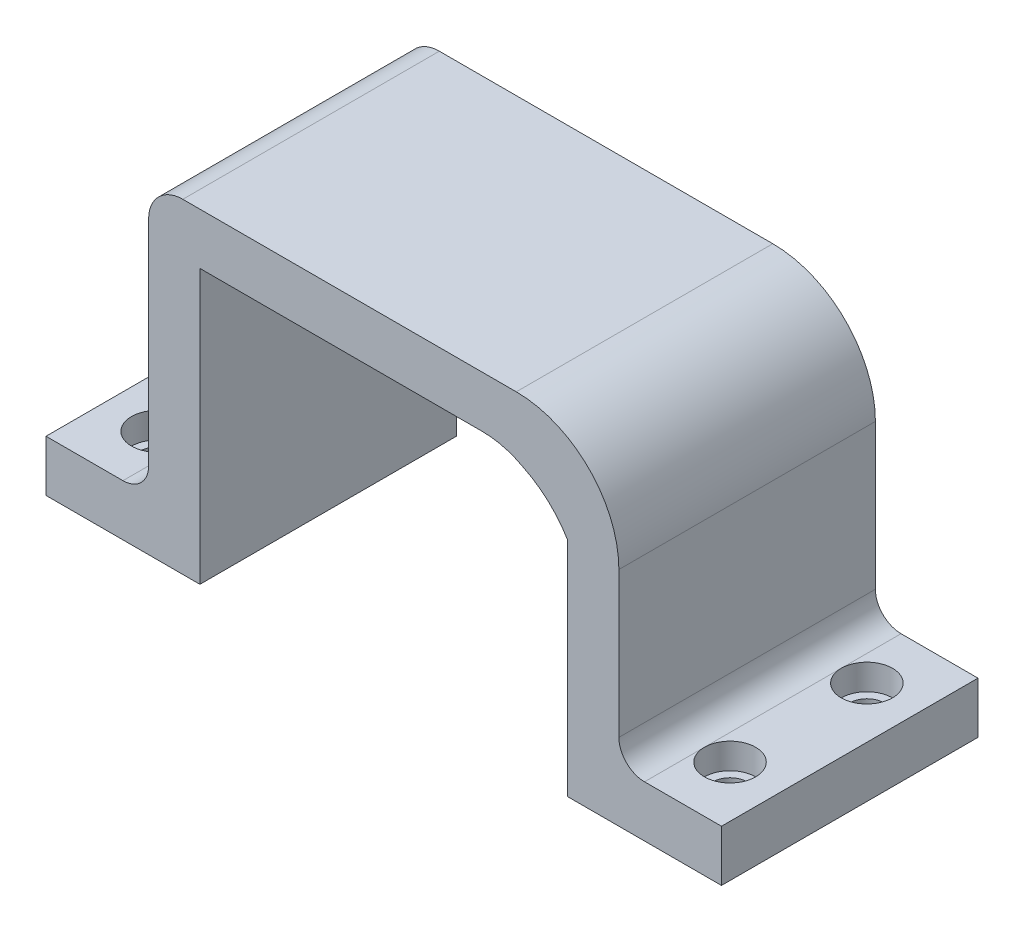
ISO-10303-21;
HEADER;
FILE_DESCRIPTION(('STEP AP214'),'2;1');
FILE_NAME('part.step','',(''),(''),'','','');
FILE_SCHEMA(('AUTOMOTIVE_DESIGN { 1 0 10303 214 1 1 1 1 }'));
ENDSEC;
DATA;
#1=APPLICATION_CONTEXT('core data for automotive mechanical design processes');
#2=APPLICATION_PROTOCOL_DEFINITION('international standard','automotive_design',2000,#1);
#3=PRODUCT_CONTEXT('',#1,'mechanical');
#4=PRODUCT('Part','Part','',(#3));
#5=PRODUCT_RELATED_PRODUCT_CATEGORY('part','',(#4));
#6=PRODUCT_DEFINITION_FORMATION('','',#4);
#7=PRODUCT_DEFINITION_CONTEXT('part definition',#1,'design');
#8=PRODUCT_DEFINITION('design','',#6,#7);
#9=PRODUCT_DEFINITION_SHAPE('','',#8);
#10=(LENGTH_UNIT() NAMED_UNIT(*) SI_UNIT(.MILLI.,.METRE.));
#11=(NAMED_UNIT(*) PLANE_ANGLE_UNIT() SI_UNIT($,.RADIAN.));
#12=(NAMED_UNIT(*) SI_UNIT($,.STERADIAN.) SOLID_ANGLE_UNIT());
#13=UNCERTAINTY_MEASURE_WITH_UNIT(LENGTH_MEASURE(1.E-05),#10,'distance_accuracy_value','');
#14=(GEOMETRIC_REPRESENTATION_CONTEXT(3) GLOBAL_UNCERTAINTY_ASSIGNED_CONTEXT((#13)) GLOBAL_UNIT_ASSIGNED_CONTEXT((#10,
#11,#12)) REPRESENTATION_CONTEXT('',''));
#15=CARTESIAN_POINT('',(0.,0.,0.));
#16=DIRECTION('',(0.,0.,1.));
#17=DIRECTION('',(1.,0.,0.));
#18=AXIS2_PLACEMENT_3D('',#15,#16,#17);
#19=CARTESIAN_POINT('',(73.,0.,23.));
#20=DIRECTION('',(0.,1.,0.));
#21=DIRECTION('',(0.,0.,1.));
#22=AXIS2_PLACEMENT_3D('',#19,#20,#21);
#23=CYLINDRICAL_SURFACE('',#22,2.);
#24=CARTESIAN_POINT('',(73.,0.,23.));
#25=DIRECTION('',(0.,1.,0.));
#26=DIRECTION('',(0.,0.,1.));
#27=AXIS2_PLACEMENT_3D('',#24,#25,#26);
#28=CIRCLE('',#27,2.);
#29=CARTESIAN_POINT('',(73.,0.,25.));
#30=VERTEX_POINT('',#29);
#31=EDGE_CURVE('E228',#30,#30,#28,.T.);
#32=ORIENTED_EDGE('',*,*,#31,.F.);
#33=EDGE_LOOP('',(#32));
#34=FACE_BOUND('',#33,.T.);
#35=CARTESIAN_POINT('',(73.,3.,23.));
#36=DIRECTION('',(0.,1.,0.));
#37=DIRECTION('',(0.,0.,1.));
#38=AXIS2_PLACEMENT_3D('',#35,#36,#37);
#39=CIRCLE('',#38,2.);
#40=CARTESIAN_POINT('',(73.,3.,25.));
#41=VERTEX_POINT('',#40);
#42=EDGE_CURVE('E208',#41,#41,#39,.T.);
#43=ORIENTED_EDGE('',*,*,#42,.T.);
#44=EDGE_LOOP('',(#43));
#45=FACE_BOUND('',#44,.T.);
#46=ADVANCED_FACE('F33',(#34,#45),#23,.F.);
#47=CARTESIAN_POINT('',(73.,0.,7.));
#48=DIRECTION('',(0.,1.,0.));
#49=DIRECTION('',(0.,0.,1.));
#50=AXIS2_PLACEMENT_3D('',#47,#48,#49);
#51=CYLINDRICAL_SURFACE('',#50,2.);
#52=CARTESIAN_POINT('',(73.,0.,7.));
#53=DIRECTION('',(0.,1.,0.));
#54=DIRECTION('',(0.,0.,1.));
#55=AXIS2_PLACEMENT_3D('',#52,#53,#54);
#56=CIRCLE('',#55,2.);
#57=CARTESIAN_POINT('',(73.,0.,9.));
#58=VERTEX_POINT('',#57);
#59=EDGE_CURVE('E231',#58,#58,#56,.T.);
#60=ORIENTED_EDGE('',*,*,#59,.F.);
#61=EDGE_LOOP('',(#60));
#62=FACE_BOUND('',#61,.T.);
#63=CARTESIAN_POINT('',(73.,3.,7.));
#64=DIRECTION('',(0.,1.,0.));
#65=DIRECTION('',(0.,0.,1.));
#66=AXIS2_PLACEMENT_3D('',#63,#64,#65);
#67=CIRCLE('',#66,2.);
#68=CARTESIAN_POINT('',(73.,3.,9.));
#69=VERTEX_POINT('',#68);
#70=EDGE_CURVE('E198',#69,#69,#67,.T.);
#71=ORIENTED_EDGE('',*,*,#70,.T.);
#72=EDGE_LOOP('',(#71));
#73=FACE_BOUND('',#72,.T.);
#74=ADVANCED_FACE('F399',(#62,#73),#51,.F.);
#75=CARTESIAN_POINT('',(6.,0.,7.));
#76=DIRECTION('',(0.,1.,0.));
#77=DIRECTION('',(0.,0.,1.));
#78=AXIS2_PLACEMENT_3D('',#75,#76,#77);
#79=CYLINDRICAL_SURFACE('',#78,2.);
#80=CARTESIAN_POINT('',(6.,0.,7.));
#81=DIRECTION('',(0.,1.,0.));
#82=DIRECTION('',(0.,0.,1.));
#83=AXIS2_PLACEMENT_3D('',#80,#81,#82);
#84=CIRCLE('',#83,2.);
#85=CARTESIAN_POINT('',(6.,0.,9.));
#86=VERTEX_POINT('',#85);
#87=EDGE_CURVE('E227',#86,#86,#84,.T.);
#88=ORIENTED_EDGE('',*,*,#87,.F.);
#89=EDGE_LOOP('',(#88));
#90=FACE_BOUND('',#89,.T.);
#91=CARTESIAN_POINT('',(6.,3.,7.));
#92=DIRECTION('',(0.,1.,0.));
#93=DIRECTION('',(0.,0.,1.));
#94=AXIS2_PLACEMENT_3D('',#91,#92,#93);
#95=CIRCLE('',#94,2.);
#96=CARTESIAN_POINT('',(6.,3.,9.));
#97=VERTEX_POINT('',#96);
#98=EDGE_CURVE('E207',#97,#97,#95,.T.);
#99=ORIENTED_EDGE('',*,*,#98,.T.);
#100=EDGE_LOOP('',(#99));
#101=FACE_BOUND('',#100,.T.);
#102=ADVANCED_FACE('F405',(#90,#101),#79,.F.);
#103=CARTESIAN_POINT('',(6.,0.,23.));
#104=DIRECTION('',(0.,1.,0.));
#105=DIRECTION('',(0.,0.,1.));
#106=AXIS2_PLACEMENT_3D('',#103,#104,#105);
#107=CYLINDRICAL_SURFACE('',#106,2.);
#108=CARTESIAN_POINT('',(6.,0.,23.));
#109=DIRECTION('',(0.,1.,0.));
#110=DIRECTION('',(0.,0.,1.));
#111=AXIS2_PLACEMENT_3D('',#108,#109,#110);
#112=CIRCLE('',#111,2.);
#113=CARTESIAN_POINT('',(6.,0.,25.));
#114=VERTEX_POINT('',#113);
#115=EDGE_CURVE('E224',#114,#114,#112,.T.);
#116=ORIENTED_EDGE('',*,*,#115,.F.);
#117=EDGE_LOOP('',(#116));
#118=FACE_BOUND('',#117,.T.);
#119=CARTESIAN_POINT('',(6.,3.,23.));
#120=DIRECTION('',(0.,1.,0.));
#121=DIRECTION('',(0.,0.,1.));
#122=AXIS2_PLACEMENT_3D('',#119,#120,#121);
#123=CIRCLE('',#122,2.);
#124=CARTESIAN_POINT('',(6.,3.,25.));
#125=VERTEX_POINT('',#124);
#126=EDGE_CURVE('E200',#125,#125,#123,.T.);
#127=ORIENTED_EDGE('',*,*,#126,.T.);
#128=EDGE_LOOP('',(#127));
#129=FACE_BOUND('',#128,.T.);
#130=ADVANCED_FACE('F411',(#118,#129),#107,.F.);
#131=CARTESIAN_POINT('',(0.,0.,30.));
#132=DIRECTION('',(1.,0.,0.));
#133=DIRECTION('',(0.,0.,-1.));
#134=AXIS2_PLACEMENT_3D('',#131,#132,#133);
#135=PLANE('',#134);
#136=DIRECTION('',(0.,-1.,0.));
#137=VECTOR('',#136,1.);
#138=CARTESIAN_POINT('',(0.,0.,0.));
#139=LINE('',#138,#137);
#140=CARTESIAN_POINT('',(0.,6.,0.));
#141=VERTEX_POINT('',#140);
#142=CARTESIAN_POINT('',(0.,0.,0.));
#143=VERTEX_POINT('',#142);
#144=EDGE_CURVE('E276',#141,#143,#139,.T.);
#145=ORIENTED_EDGE('',*,*,#144,.T.);
#146=DIRECTION('',(0.,0.,-1.));
#147=VECTOR('',#146,1.);
#148=CARTESIAN_POINT('',(0.,0.,30.));
#149=LINE('',#148,#147);
#150=CARTESIAN_POINT('',(0.,0.,30.));
#151=VERTEX_POINT('',#150);
#152=EDGE_CURVE('E321',#151,#143,#149,.T.);
#153=ORIENTED_EDGE('',*,*,#152,.F.);
#154=DIRECTION('',(0.,-1.,0.));
#155=VECTOR('',#154,1.);
#156=CARTESIAN_POINT('',(0.,0.,30.));
#157=LINE('',#156,#155);
#158=CARTESIAN_POINT('',(0.,6.,30.));
#159=VERTEX_POINT('',#158);
#160=EDGE_CURVE('E277',#159,#151,#157,.T.);
#161=ORIENTED_EDGE('',*,*,#160,.F.);
#162=DIRECTION('',(0.,0.,1.));
#163=VECTOR('',#162,1.);
#164=CARTESIAN_POINT('',(0.,6.,-86.0058137569781));
#165=LINE('',#164,#163);
#166=EDGE_CURVE('E242',#141,#159,#165,.T.);
#167=ORIENTED_EDGE('',*,*,#166,.F.);
#168=EDGE_LOOP('',(#145,#153,#161,#167));
#169=FACE_BOUND('',#168,.T.);
#170=ADVANCED_FACE('F469',(#169),#135,.F.);
#171=CARTESIAN_POINT('',(0.,0.,30.));
#172=DIRECTION('',(0.,1.,0.));
#173=DIRECTION('',(0.,0.,1.));
#174=AXIS2_PLACEMENT_3D('',#171,#172,#173);
#175=PLANE('',#174);
#176=ORIENTED_EDGE('',*,*,#115,.T.);
#177=EDGE_LOOP('',(#176));
#178=FACE_BOUND('',#177,.T.);
#179=ORIENTED_EDGE('',*,*,#87,.T.);
#180=EDGE_LOOP('',(#179));
#181=FACE_BOUND('',#180,.T.);
#182=DIRECTION('',(1.,0.,0.));
#183=VECTOR('',#182,1.);
#184=CARTESIAN_POINT('',(0.,0.,0.));
#185=LINE('',#184,#183);
#186=CARTESIAN_POINT('',(18.,0.,0.));
#187=VERTEX_POINT('',#186);
#188=EDGE_CURVE('E298',#143,#187,#185,.T.);
#189=ORIENTED_EDGE('',*,*,#188,.T.);
#190=DIRECTION('',(0.,0.,-1.));
#191=VECTOR('',#190,1.);
#192=CARTESIAN_POINT('',(18.,0.,30.));
#193=LINE('',#192,#191);
#194=CARTESIAN_POINT('',(18.,0.,30.));
#195=VERTEX_POINT('',#194);
#196=EDGE_CURVE('E318',#195,#187,#193,.T.);
#197=ORIENTED_EDGE('',*,*,#196,.F.);
#198=DIRECTION('',(1.,0.,0.));
#199=VECTOR('',#198,1.);
#200=CARTESIAN_POINT('',(0.,0.,30.));
#201=LINE('',#200,#199);
#202=EDGE_CURVE('E280',#151,#195,#201,.T.);
#203=ORIENTED_EDGE('',*,*,#202,.F.);
#204=ORIENTED_EDGE('',*,*,#152,.T.);
#205=EDGE_LOOP('',(#189,#197,#203,#204));
#206=FACE_BOUND('',#205,.T.);
#207=ADVANCED_FACE('F465',(#178,#181,#206),#175,.F.);
#208=CARTESIAN_POINT('',(18.,0.,30.));
#209=DIRECTION('',(-1.,0.,0.));
#210=DIRECTION('',(0.,0.,1.));
#211=AXIS2_PLACEMENT_3D('',#208,#209,#210);
#212=PLANE('',#211);
#213=DIRECTION('',(0.,1.,0.));
#214=VECTOR('',#213,1.);
#215=CARTESIAN_POINT('',(18.,0.,0.));
#216=LINE('',#215,#214);
#217=CARTESIAN_POINT('',(18.,32.,0.));
#218=VERTEX_POINT('',#217);
#219=EDGE_CURVE('E300',#187,#218,#216,.T.);
#220=ORIENTED_EDGE('',*,*,#219,.T.);
#221=DIRECTION('',(0.,0.,-1.));
#222=VECTOR('',#221,1.);
#223=CARTESIAN_POINT('',(18.,32.,30.));
#224=LINE('',#223,#222);
#225=CARTESIAN_POINT('',(18.,32.,30.));
#226=VERTEX_POINT('',#225);
#227=EDGE_CURVE('E315',#226,#218,#224,.T.);
#228=ORIENTED_EDGE('',*,*,#227,.F.);
#229=DIRECTION('',(0.,1.,0.));
#230=VECTOR('',#229,1.);
#231=CARTESIAN_POINT('',(18.,0.,30.));
#232=LINE('',#231,#230);
#233=EDGE_CURVE('E283',#195,#226,#232,.T.);
#234=ORIENTED_EDGE('',*,*,#233,.F.);
#235=ORIENTED_EDGE('',*,*,#196,.T.);
#236=EDGE_LOOP('',(#220,#228,#234,#235));
#237=FACE_BOUND('',#236,.T.);
#238=ADVANCED_FACE('F461',(#237),#212,.F.);
#239=CARTESIAN_POINT('',(18.,32.,30.));
#240=DIRECTION('',(0.,1.,0.));
#241=DIRECTION('',(0.,0.,1.));
#242=AXIS2_PLACEMENT_3D('',#239,#240,#241);
#243=PLANE('',#242);
#244=DIRECTION('',(1.,0.,0.));
#245=VECTOR('',#244,1.);
#246=CARTESIAN_POINT('',(18.,32.,0.));
#247=LINE('',#246,#245);
#248=CARTESIAN_POINT('',(51.,32.,0.));
#249=VERTEX_POINT('',#248);
#250=EDGE_CURVE('E302',#218,#249,#247,.T.);
#251=ORIENTED_EDGE('',*,*,#250,.T.);
#252=DIRECTION('',(0.,0.,-1.));
#253=VECTOR('',#252,1.);
#254=CARTESIAN_POINT('',(51.,32.,30.));
#255=LINE('',#254,#253);
#256=CARTESIAN_POINT('',(51.,32.,30.));
#257=VERTEX_POINT('',#256);
#258=EDGE_CURVE('E312',#257,#249,#255,.T.);
#259=ORIENTED_EDGE('',*,*,#258,.F.);
#260=DIRECTION('',(1.,0.,0.));
#261=VECTOR('',#260,1.);
#262=CARTESIAN_POINT('',(18.,32.,30.));
#263=LINE('',#262,#261);
#264=EDGE_CURVE('E285',#226,#257,#263,.T.);
#265=ORIENTED_EDGE('',*,*,#264,.F.);
#266=ORIENTED_EDGE('',*,*,#227,.T.);
#267=EDGE_LOOP('',(#251,#259,#265,#266));
#268=FACE_BOUND('',#267,.T.);
#269=ADVANCED_FACE('F457',(#268),#243,.F.);
#270=CARTESIAN_POINT('',(51.,22.,30.));
#271=DIRECTION('',(0.,0.,-1.));
#272=DIRECTION('',(-1.,0.,0.));
#273=AXIS2_PLACEMENT_3D('',#270,#271,#272);
#274=CYLINDRICAL_SURFACE('',#273,10.);
#275=CARTESIAN_POINT('',(51.,22.,0.));
#276=DIRECTION('',(0.,0.,-1.));
#277=DIRECTION('',(-1.,0.,0.));
#278=AXIS2_PLACEMENT_3D('',#275,#276,#277);
#279=CIRCLE('',#278,10.);
#280=CARTESIAN_POINT('',(55.7684741420039,30.7898608838274,0.));
#281=VERTEX_POINT('',#280);
#282=EDGE_CURVE('E182',#249,#281,#279,.T.);
#283=ORIENTED_EDGE('',*,*,#282,.T.);
#284=DIRECTION('',(0.,0.,1.));
#285=VECTOR('',#284,1.);
#286=CARTESIAN_POINT('',(55.7684741420039,30.7898608838274,0.));
#287=LINE('',#286,#285);
#288=CARTESIAN_POINT('',(55.7684741420039,30.7898608838274,30.));
#289=VERTEX_POINT('',#288);
#290=EDGE_CURVE('E190',#281,#289,#287,.T.);
#291=ORIENTED_EDGE('',*,*,#290,.T.);
#292=CARTESIAN_POINT('',(51.,22.,30.));
#293=DIRECTION('',(0.,0.,-1.));
#294=DIRECTION('',(-1.,0.,0.));
#295=AXIS2_PLACEMENT_3D('',#292,#293,#294);
#296=CIRCLE('',#295,10.);
#297=EDGE_CURVE('E287',#257,#289,#296,.T.);
#298=ORIENTED_EDGE('',*,*,#297,.F.);
#299=ORIENTED_EDGE('',*,*,#258,.T.);
#300=EDGE_LOOP('',(#283,#291,#298,#299));
#301=FACE_BOUND('',#300,.T.);
#302=ADVANCED_FACE('F454',(#301),#274,.F.);
#303=CARTESIAN_POINT('',(61.,22.,30.));
#304=DIRECTION('',(1.,0.,0.));
#305=DIRECTION('',(0.,0.,-1.));
#306=AXIS2_PLACEMENT_3D('',#303,#304,#305);
#307=PLANE('',#306);
#308=DIRECTION('',(0.,-1.,0.));
#309=VECTOR('',#308,1.);
#310=CARTESIAN_POINT('',(61.,22.,0.));
#311=LINE('',#310,#309);
#312=CARTESIAN_POINT('',(61.,26.007623501962,0.));
#313=VERTEX_POINT('',#312);
#314=CARTESIAN_POINT('',(61.,0.,0.));
#315=VERTEX_POINT('',#314);
#316=EDGE_CURVE('E170',#313,#315,#311,.T.);
#317=ORIENTED_EDGE('',*,*,#316,.T.);
#318=DIRECTION('',(0.,0.,-1.));
#319=VECTOR('',#318,1.);
#320=CARTESIAN_POINT('',(61.,0.,30.));
#321=LINE('',#320,#319);
#322=CARTESIAN_POINT('',(61.,0.,30.));
#323=VERTEX_POINT('',#322);
#324=EDGE_CURVE('E310',#323,#315,#321,.T.);
#325=ORIENTED_EDGE('',*,*,#324,.F.);
#326=DIRECTION('',(0.,-1.,0.));
#327=VECTOR('',#326,1.);
#328=CARTESIAN_POINT('',(61.,22.,30.));
#329=LINE('',#328,#327);
#330=CARTESIAN_POINT('',(61.,26.007623501962,30.));
#331=VERTEX_POINT('',#330);
#332=EDGE_CURVE('E187',#331,#323,#329,.T.);
#333=ORIENTED_EDGE('',*,*,#332,.F.);
#334=DIRECTION('',(0.,0.,1.));
#335=VECTOR('',#334,1.);
#336=CARTESIAN_POINT('',(61.,26.007623501962,0.));
#337=LINE('',#336,#335);
#338=EDGE_CURVE('E185',#313,#331,#337,.T.);
#339=ORIENTED_EDGE('',*,*,#338,.F.);
#340=EDGE_LOOP('',(#317,#325,#333,#339));
#341=FACE_BOUND('',#340,.T.);
#342=ADVANCED_FACE('F186',(#341),#307,.F.);
#343=CARTESIAN_POINT('',(61.,0.,30.));
#344=DIRECTION('',(0.,1.,0.));
#345=DIRECTION('',(0.,0.,1.));
#346=AXIS2_PLACEMENT_3D('',#343,#344,#345);
#347=PLANE('',#346);
#348=ORIENTED_EDGE('',*,*,#59,.T.);
#349=EDGE_LOOP('',(#348));
#350=FACE_BOUND('',#349,.T.);
#351=ORIENTED_EDGE('',*,*,#31,.T.);
#352=EDGE_LOOP('',(#351));
#353=FACE_BOUND('',#352,.T.);
#354=DIRECTION('',(1.,0.,0.));
#355=VECTOR('',#354,1.);
#356=CARTESIAN_POINT('',(61.,0.,0.));
#357=LINE('',#356,#355);
#358=CARTESIAN_POINT('',(79.,0.,0.));
#359=VERTEX_POINT('',#358);
#360=EDGE_CURVE('E178',#315,#359,#357,.T.);
#361=ORIENTED_EDGE('',*,*,#360,.T.);
#362=DIRECTION('',(0.,0.,-1.));
#363=VECTOR('',#362,1.);
#364=CARTESIAN_POINT('',(79.,0.,30.));
#365=LINE('',#364,#363);
#366=CARTESIAN_POINT('',(79.,0.,30.));
#367=VERTEX_POINT('',#366);
#368=EDGE_CURVE('E295',#367,#359,#365,.T.);
#369=ORIENTED_EDGE('',*,*,#368,.F.);
#370=DIRECTION('',(1.,0.,0.));
#371=VECTOR('',#370,1.);
#372=CARTESIAN_POINT('',(61.,0.,30.));
#373=LINE('',#372,#371);
#374=EDGE_CURVE('E291',#323,#367,#373,.T.);
#375=ORIENTED_EDGE('',*,*,#374,.F.);
#376=ORIENTED_EDGE('',*,*,#324,.T.);
#377=EDGE_LOOP('',(#361,#369,#375,#376));
#378=FACE_BOUND('',#377,.T.);
#379=ADVANCED_FACE('F447',(#350,#353,#378),#347,.F.);
#380=CARTESIAN_POINT('',(79.,0.,30.));
#381=DIRECTION('',(-1.,0.,0.));
#382=DIRECTION('',(0.,0.,1.));
#383=AXIS2_PLACEMENT_3D('',#380,#381,#382);
#384=PLANE('',#383);
#385=DIRECTION('',(0.,1.,0.));
#386=VECTOR('',#385,1.);
#387=CARTESIAN_POINT('',(79.,0.,0.));
#388=LINE('',#387,#386);
#389=CARTESIAN_POINT('',(79.,6.,0.));
#390=VERTEX_POINT('',#389);
#391=EDGE_CURVE('E281',#359,#390,#388,.T.);
#392=ORIENTED_EDGE('',*,*,#391,.T.);
#393=DIRECTION('',(0.,0.,1.));
#394=VECTOR('',#393,1.);
#395=CARTESIAN_POINT('',(79.,6.,-86.0058137569781));
#396=LINE('',#395,#394);
#397=CARTESIAN_POINT('',(79.,6.,30.));
#398=VERTEX_POINT('',#397);
#399=EDGE_CURVE('E265',#390,#398,#396,.T.);
#400=ORIENTED_EDGE('',*,*,#399,.T.);
#401=DIRECTION('',(0.,1.,0.));
#402=VECTOR('',#401,1.);
#403=CARTESIAN_POINT('',(79.,0.,30.));
#404=LINE('',#403,#402);
#405=EDGE_CURVE('E293',#367,#398,#404,.T.);
#406=ORIENTED_EDGE('',*,*,#405,.F.);
#407=ORIENTED_EDGE('',*,*,#368,.T.);
#408=EDGE_LOOP('',(#392,#400,#406,#407));
#409=FACE_BOUND('',#408,.T.);
#410=ADVANCED_FACE('F442',(#409),#384,.F.);
#411=CARTESIAN_POINT('',(55.,26.,30.));
#412=DIRECTION('',(0.,0.,1.));
#413=DIRECTION('',(1.,0.,0.));
#414=AXIS2_PLACEMENT_3D('',#411,#412,#413);
#415=PLANE('',#414);
#416=DIRECTION('',(-1.,0.,0.));
#417=VECTOR('',#416,1.);
#418=CARTESIAN_POINT('',(55.,38.,30.));
#419=LINE('',#418,#417);
#420=CARTESIAN_POINT('',(55.,38.,30.));
#421=VERTEX_POINT('',#420);
#422=CARTESIAN_POINT('',(16.,38.,30.));
#423=VERTEX_POINT('',#422);
#424=EDGE_CURVE('E258',#421,#423,#419,.T.);
#425=ORIENTED_EDGE('',*,*,#424,.T.);
#426=CARTESIAN_POINT('',(16.,34.,30.));
#427=DIRECTION('',(0.,0.,1.));
#428=DIRECTION('',(1.,0.,0.));
#429=AXIS2_PLACEMENT_3D('',#426,#427,#428);
#430=CIRCLE('',#429,4.);
#431=CARTESIAN_POINT('',(12.,34.,30.));
#432=VERTEX_POINT('',#431);
#433=EDGE_CURVE('E336',#423,#432,#430,.T.);
#434=ORIENTED_EDGE('',*,*,#433,.T.);
#435=DIRECTION('',(0.,-1.,0.));
#436=VECTOR('',#435,1.);
#437=CARTESIAN_POINT('',(12.,38.,30.));
#438=LINE('',#437,#436);
#439=CARTESIAN_POINT('',(12.,9.,30.));
#440=VERTEX_POINT('',#439);
#441=EDGE_CURVE('E261',#432,#440,#438,.T.);
#442=ORIENTED_EDGE('',*,*,#441,.T.);
#443=CARTESIAN_POINT('',(9.,9.,30.));
#444=DIRECTION('',(0.,0.,1.));
#445=DIRECTION('',(1.,0.,0.));
#446=AXIS2_PLACEMENT_3D('',#443,#444,#445);
#447=CIRCLE('',#446,3.);
#448=CARTESIAN_POINT('',(9.,6.,30.));
#449=VERTEX_POINT('',#448);
#450=EDGE_CURVE('E41',#440,#449,#447,.F.);
#451=ORIENTED_EDGE('',*,*,#450,.T.);
#452=DIRECTION('',(-1.,0.,0.));
#453=VECTOR('',#452,1.);
#454=CARTESIAN_POINT('',(12.,6.,30.));
#455=LINE('',#454,#453);
#456=EDGE_CURVE('E263',#449,#159,#455,.T.);
#457=ORIENTED_EDGE('',*,*,#456,.T.);
#458=ORIENTED_EDGE('',*,*,#160,.T.);
#459=ORIENTED_EDGE('',*,*,#202,.T.);
#460=ORIENTED_EDGE('',*,*,#233,.T.);
#461=ORIENTED_EDGE('',*,*,#264,.T.);
#462=ORIENTED_EDGE('',*,*,#297,.T.);
#463=CARTESIAN_POINT('',(50.4100655391118,19.6754017908952,30.));
#464=DIRECTION('',(0.,0.,1.));
#465=DIRECTION('',(1.,0.,0.));
#466=AXIS2_PLACEMENT_3D('',#463,#464,#465);
#467=CIRCLE('',#466,12.3387091579311);
#468=EDGE_CURVE('E194',#331,#289,#467,.T.);
#469=ORIENTED_EDGE('',*,*,#468,.F.);
#470=ORIENTED_EDGE('',*,*,#332,.T.);
#471=ORIENTED_EDGE('',*,*,#374,.T.);
#472=ORIENTED_EDGE('',*,*,#405,.T.);
#473=DIRECTION('',(-1.,0.,0.));
#474=VECTOR('',#473,1.);
#475=CARTESIAN_POINT('',(79.,6.,30.));
#476=LINE('',#475,#474);
#477=CARTESIAN_POINT('',(70.,6.,30.));
#478=VERTEX_POINT('',#477);
#479=EDGE_CURVE('E237',#398,#478,#476,.T.);
#480=ORIENTED_EDGE('',*,*,#479,.T.);
#481=CARTESIAN_POINT('',(70.,9.,30.));
#482=DIRECTION('',(0.,0.,1.));
#483=DIRECTION('',(1.,0.,0.));
#484=AXIS2_PLACEMENT_3D('',#481,#482,#483);
#485=CIRCLE('',#484,3.);
#486=CARTESIAN_POINT('',(67.,9.,30.));
#487=VERTEX_POINT('',#486);
#488=EDGE_CURVE('E360',#478,#487,#485,.F.);
#489=ORIENTED_EDGE('',*,*,#488,.T.);
#490=DIRECTION('',(0.,1.,0.));
#491=VECTOR('',#490,1.);
#492=CARTESIAN_POINT('',(67.,6.,30.));
#493=LINE('',#492,#491);
#494=CARTESIAN_POINT('',(67.,26.,30.));
#495=VERTEX_POINT('',#494);
#496=EDGE_CURVE('E253',#487,#495,#493,.T.);
#497=ORIENTED_EDGE('',*,*,#496,.T.);
#498=CARTESIAN_POINT('',(55.,26.,30.));
#499=DIRECTION('',(0.,0.,1.));
#500=DIRECTION('',(1.,0.,0.));
#501=AXIS2_PLACEMENT_3D('',#498,#499,#500);
#502=CIRCLE('',#501,12.);
#503=EDGE_CURVE('E255',#495,#421,#502,.T.);
#504=ORIENTED_EDGE('',*,*,#503,.T.);
#505=EDGE_LOOP('',(#425,#434,#442,#451,#457,#458,#459,#460,#461,#462,#469,#470,#471,#472,#480,
#489,#497,#504));
#506=FACE_BOUND('',#505,.T.);
#507=ADVANCED_FACE('F439',(#506),#415,.T.);
#508=CARTESIAN_POINT('',(55.,26.,0.));
#509=DIRECTION('',(0.,0.,1.));
#510=DIRECTION('',(1.,0.,0.));
#511=AXIS2_PLACEMENT_3D('',#508,#509,#510);
#512=PLANE('',#511);
#513=DIRECTION('',(1.,0.,0.));
#514=VECTOR('',#513,1.);
#515=CARTESIAN_POINT('',(12.,6.,0.));
#516=LINE('',#515,#514);
#517=CARTESIAN_POINT('',(9.,6.,0.));
#518=VERTEX_POINT('',#517);
#519=EDGE_CURVE('E248',#141,#518,#516,.T.);
#520=ORIENTED_EDGE('',*,*,#519,.T.);
#521=CARTESIAN_POINT('',(9.,9.,0.));
#522=DIRECTION('',(0.,0.,1.));
#523=DIRECTION('',(1.,0.,0.));
#524=AXIS2_PLACEMENT_3D('',#521,#522,#523);
#525=CIRCLE('',#524,3.);
#526=CARTESIAN_POINT('',(12.,9.,0.));
#527=VERTEX_POINT('',#526);
#528=EDGE_CURVE('E11',#518,#527,#525,.T.);
#529=ORIENTED_EDGE('',*,*,#528,.T.);
#530=DIRECTION('',(0.,1.,0.));
#531=VECTOR('',#530,1.);
#532=CARTESIAN_POINT('',(12.,38.,0.));
#533=LINE('',#532,#531);
#534=CARTESIAN_POINT('',(12.,34.,0.));
#535=VERTEX_POINT('',#534);
#536=EDGE_CURVE('E246',#527,#535,#533,.T.);
#537=ORIENTED_EDGE('',*,*,#536,.T.);
#538=CARTESIAN_POINT('',(16.,34.,0.));
#539=DIRECTION('',(0.,0.,1.));
#540=DIRECTION('',(1.,0.,0.));
#541=AXIS2_PLACEMENT_3D('',#538,#539,#540);
#542=CIRCLE('',#541,4.);
#543=CARTESIAN_POINT('',(16.,38.,0.));
#544=VERTEX_POINT('',#543);
#545=EDGE_CURVE('E341',#535,#544,#542,.F.);
#546=ORIENTED_EDGE('',*,*,#545,.T.);
#547=DIRECTION('',(1.,0.,0.));
#548=VECTOR('',#547,1.);
#549=CARTESIAN_POINT('',(55.,38.,0.));
#550=LINE('',#549,#548);
#551=CARTESIAN_POINT('',(55.,38.,0.));
#552=VERTEX_POINT('',#551);
#553=EDGE_CURVE('E244',#544,#552,#550,.T.);
#554=ORIENTED_EDGE('',*,*,#553,.T.);
#555=CARTESIAN_POINT('',(55.,26.,0.));
#556=DIRECTION('',(0.,0.,1.));
#557=DIRECTION('',(1.,0.,0.));
#558=AXIS2_PLACEMENT_3D('',#555,#556,#557);
#559=CIRCLE('',#558,12.);
#560=CARTESIAN_POINT('',(67.,26.,0.));
#561=VERTEX_POINT('',#560);
#562=EDGE_CURVE('E241',#552,#561,#559,.F.);
#563=ORIENTED_EDGE('',*,*,#562,.T.);
#564=DIRECTION('',(0.,-1.,0.));
#565=VECTOR('',#564,1.);
#566=CARTESIAN_POINT('',(67.,6.,0.));
#567=LINE('',#566,#565);
#568=CARTESIAN_POINT('',(67.,9.,0.));
#569=VERTEX_POINT('',#568);
#570=EDGE_CURVE('E238',#561,#569,#567,.T.);
#571=ORIENTED_EDGE('',*,*,#570,.T.);
#572=CARTESIAN_POINT('',(70.,9.,0.));
#573=DIRECTION('',(0.,0.,1.));
#574=DIRECTION('',(1.,0.,0.));
#575=AXIS2_PLACEMENT_3D('',#572,#573,#574);
#576=CIRCLE('',#575,3.);
#577=CARTESIAN_POINT('',(70.,6.,0.));
#578=VERTEX_POINT('',#577);
#579=EDGE_CURVE('E362',#569,#578,#576,.T.);
#580=ORIENTED_EDGE('',*,*,#579,.T.);
#581=DIRECTION('',(1.,0.,0.));
#582=VECTOR('',#581,1.);
#583=CARTESIAN_POINT('',(79.,6.,0.));
#584=LINE('',#583,#582);
#585=EDGE_CURVE('E250',#578,#390,#584,.T.);
#586=ORIENTED_EDGE('',*,*,#585,.T.);
#587=ORIENTED_EDGE('',*,*,#391,.F.);
#588=ORIENTED_EDGE('',*,*,#360,.F.);
#589=ORIENTED_EDGE('',*,*,#316,.F.);
#590=CARTESIAN_POINT('',(50.4100655391118,19.6754017908952,0.));
#591=DIRECTION('',(0.,0.,1.));
#592=DIRECTION('',(1.,0.,0.));
#593=AXIS2_PLACEMENT_3D('',#590,#591,#592);
#594=CIRCLE('',#593,12.3387091579311);
#595=EDGE_CURVE('E175',#313,#281,#594,.T.);
#596=ORIENTED_EDGE('',*,*,#595,.T.);
#597=ORIENTED_EDGE('',*,*,#282,.F.);
#598=ORIENTED_EDGE('',*,*,#250,.F.);
#599=ORIENTED_EDGE('',*,*,#219,.F.);
#600=ORIENTED_EDGE('',*,*,#188,.F.);
#601=ORIENTED_EDGE('',*,*,#144,.F.);
#602=EDGE_LOOP('',(#520,#529,#537,#546,#554,#563,#571,#580,#586,#587,#588,#589,#596,#597,#598,
#599,#600,#601));
#603=FACE_BOUND('',#602,.T.);
#604=ADVANCED_FACE('F172',(#603),#512,.F.);
#605=CARTESIAN_POINT('',(12.,6.,-86.0058137569781));
#606=DIRECTION('',(0.,1.,0.));
#607=DIRECTION('',(0.,0.,1.));
#608=AXIS2_PLACEMENT_3D('',#605,#606,#607);
#609=PLANE('',#608);
#610=ORIENTED_EDGE('',*,*,#456,.F.);
#611=DIRECTION('',(0.,0.,1.));
#612=VECTOR('',#611,1.);
#613=CARTESIAN_POINT('',(9.,6.,0.));
#614=LINE('',#613,#612);
#615=CARTESIAN_POINT('',(9.,6.,23.));
#616=VERTEX_POINT('',#615);
#617=EDGE_CURVE('E358',#449,#616,#614,.F.);
#618=ORIENTED_EDGE('',*,*,#617,.T.);
#619=CARTESIAN_POINT('',(6.,6.,23.));
#620=DIRECTION('',(0.,1.,0.));
#621=DIRECTION('',(0.,0.,1.));
#622=AXIS2_PLACEMENT_3D('',#619,#620,#621);
#623=CIRCLE('',#622,3.);
#624=EDGE_CURVE('E234',#616,#616,#623,.F.);
#625=ORIENTED_EDGE('',*,*,#624,.T.);
#626=DIRECTION('',(0.,0.,1.));
#627=VECTOR('',#626,1.);
#628=CARTESIAN_POINT('',(9.,6.,0.));
#629=LINE('',#628,#627);
#630=CARTESIAN_POINT('',(9.,6.,7.));
#631=VERTEX_POINT('',#630);
#632=EDGE_CURVE('E356',#616,#631,#629,.F.);
#633=ORIENTED_EDGE('',*,*,#632,.T.);
#634=CARTESIAN_POINT('',(6.,6.,7.));
#635=DIRECTION('',(0.,1.,0.));
#636=DIRECTION('',(0.,0.,1.));
#637=AXIS2_PLACEMENT_3D('',#634,#635,#636);
#638=CIRCLE('',#637,3.);
#639=EDGE_CURVE('E330',#631,#631,#638,.F.);
#640=ORIENTED_EDGE('',*,*,#639,.T.);
#641=DIRECTION('',(0.,0.,1.));
#642=VECTOR('',#641,1.);
#643=CARTESIAN_POINT('',(9.,6.,0.));
#644=LINE('',#643,#642);
#645=EDGE_CURVE('E55',#631,#518,#644,.F.);
#646=ORIENTED_EDGE('',*,*,#645,.T.);
#647=ORIENTED_EDGE('',*,*,#519,.F.);
#648=ORIENTED_EDGE('',*,*,#166,.T.);
#649=EDGE_LOOP('',(#610,#618,#625,#633,#640,#646,#647,#648));
#650=FACE_BOUND('',#649,.T.);
#651=ADVANCED_FACE('F417',(#650),#609,.T.);
#652=CARTESIAN_POINT('',(12.,38.,-86.0058137569781));
#653=DIRECTION('',(-1.,0.,0.));
#654=DIRECTION('',(0.,-1.,0.));
#655=AXIS2_PLACEMENT_3D('',#652,#653,#654);
#656=PLANE('',#655);
#657=ORIENTED_EDGE('',*,*,#536,.F.);
#658=DIRECTION('',(0.,0.,1.));
#659=VECTOR('',#658,1.);
#660=CARTESIAN_POINT('',(12.,9.,30.));
#661=LINE('',#660,#659);
#662=EDGE_CURVE('E352',#527,#440,#661,.T.);
#663=ORIENTED_EDGE('',*,*,#662,.T.);
#664=ORIENTED_EDGE('',*,*,#441,.F.);
#665=DIRECTION('',(0.,0.,1.));
#666=VECTOR('',#665,1.);
#667=CARTESIAN_POINT('',(12.,34.,-86.0058137569781));
#668=LINE('',#667,#666);
#669=EDGE_CURVE('E338',#432,#535,#668,.F.);
#670=ORIENTED_EDGE('',*,*,#669,.T.);
#671=EDGE_LOOP('',(#657,#663,#664,#670));
#672=FACE_BOUND('',#671,.T.);
#673=ADVANCED_FACE('F420',(#672),#656,.T.);
#674=CARTESIAN_POINT('',(55.,38.,-86.0058137569781));
#675=DIRECTION('',(0.,1.,0.));
#676=DIRECTION('',(0.,0.,1.));
#677=AXIS2_PLACEMENT_3D('',#674,#675,#676);
#678=PLANE('',#677);
#679=ORIENTED_EDGE('',*,*,#553,.F.);
#680=DIRECTION('',(0.,0.,1.));
#681=VECTOR('',#680,1.);
#682=CARTESIAN_POINT('',(16.,38.,-86.0058137569781));
#683=LINE('',#682,#681);
#684=EDGE_CURVE('E324',#544,#423,#683,.T.);
#685=ORIENTED_EDGE('',*,*,#684,.T.);
#686=ORIENTED_EDGE('',*,*,#424,.F.);
#687=DIRECTION('',(0.,0.,1.));
#688=VECTOR('',#687,1.);
#689=CARTESIAN_POINT('',(55.,38.,-86.0058137569781));
#690=LINE('',#689,#688);
#691=EDGE_CURVE('E268',#552,#421,#690,.T.);
#692=ORIENTED_EDGE('',*,*,#691,.F.);
#693=EDGE_LOOP('',(#679,#685,#686,#692));
#694=FACE_BOUND('',#693,.T.);
#695=ADVANCED_FACE('F423',(#694),#678,.T.);
#696=CARTESIAN_POINT('',(55.,26.,-86.0058137569781));
#697=DIRECTION('',(0.,0.,1.));
#698=DIRECTION('',(1.,0.,0.));
#699=AXIS2_PLACEMENT_3D('',#696,#697,#698);
#700=CYLINDRICAL_SURFACE('',#699,12.);
#701=ORIENTED_EDGE('',*,*,#562,.F.);
#702=ORIENTED_EDGE('',*,*,#691,.T.);
#703=ORIENTED_EDGE('',*,*,#503,.F.);
#704=DIRECTION('',(0.,0.,1.));
#705=VECTOR('',#704,1.);
#706=CARTESIAN_POINT('',(67.,26.,-86.0058137569781));
#707=LINE('',#706,#705);
#708=EDGE_CURVE('E270',#561,#495,#707,.T.);
#709=ORIENTED_EDGE('',*,*,#708,.F.);
#710=EDGE_LOOP('',(#701,#702,#703,#709));
#711=FACE_BOUND('',#710,.T.);
#712=ADVANCED_FACE('F427',(#711),#700,.T.);
#713=CARTESIAN_POINT('',(67.,6.,-86.0058137569781));
#714=DIRECTION('',(1.,0.,0.));
#715=DIRECTION('',(0.,0.,-1.));
#716=AXIS2_PLACEMENT_3D('',#713,#714,#715);
#717=PLANE('',#716);
#718=ORIENTED_EDGE('',*,*,#496,.F.);
#719=DIRECTION('',(0.,0.,1.));
#720=VECTOR('',#719,1.);
#721=CARTESIAN_POINT('',(67.,9.,0.));
#722=LINE('',#721,#720);
#723=EDGE_CURVE('E350',#487,#569,#722,.F.);
#724=ORIENTED_EDGE('',*,*,#723,.T.);
#725=ORIENTED_EDGE('',*,*,#570,.F.);
#726=ORIENTED_EDGE('',*,*,#708,.T.);
#727=EDGE_LOOP('',(#718,#724,#725,#726));
#728=FACE_BOUND('',#727,.T.);
#729=ADVANCED_FACE('F431',(#728),#717,.T.);
#730=CARTESIAN_POINT('',(79.,6.,-86.0058137569781));
#731=DIRECTION('',(0.,1.,0.));
#732=DIRECTION('',(0.,0.,1.));
#733=AXIS2_PLACEMENT_3D('',#730,#731,#732);
#734=PLANE('',#733);
#735=ORIENTED_EDGE('',*,*,#585,.F.);
#736=DIRECTION('',(0.,0.,1.));
#737=VECTOR('',#736,1.);
#738=CARTESIAN_POINT('',(70.,6.,30.));
#739=LINE('',#738,#737);
#740=CARTESIAN_POINT('',(70.,6.,7.));
#741=VERTEX_POINT('',#740);
#742=EDGE_CURVE('E347',#578,#741,#739,.T.);
#743=ORIENTED_EDGE('',*,*,#742,.T.);
#744=CARTESIAN_POINT('',(73.,6.,7.));
#745=DIRECTION('',(0.,1.,0.));
#746=DIRECTION('',(0.,0.,1.));
#747=AXIS2_PLACEMENT_3D('',#744,#745,#746);
#748=CIRCLE('',#747,3.00000000000001);
#749=EDGE_CURVE('E327',#741,#741,#748,.F.);
#750=ORIENTED_EDGE('',*,*,#749,.T.);
#751=DIRECTION('',(0.,0.,1.));
#752=VECTOR('',#751,1.);
#753=CARTESIAN_POINT('',(70.,6.,30.));
#754=LINE('',#753,#752);
#755=CARTESIAN_POINT('',(70.,6.,23.));
#756=VERTEX_POINT('',#755);
#757=EDGE_CURVE('E345',#741,#756,#754,.T.);
#758=ORIENTED_EDGE('',*,*,#757,.T.);
#759=CARTESIAN_POINT('',(73.,6.,23.));
#760=DIRECTION('',(0.,1.,0.));
#761=DIRECTION('',(0.,0.,1.));
#762=AXIS2_PLACEMENT_3D('',#759,#760,#761);
#763=CIRCLE('',#762,3.00000000000001);
#764=EDGE_CURVE('E223',#756,#756,#763,.F.);
#765=ORIENTED_EDGE('',*,*,#764,.T.);
#766=DIRECTION('',(0.,0.,1.));
#767=VECTOR('',#766,1.);
#768=CARTESIAN_POINT('',(70.,6.,30.));
#769=LINE('',#768,#767);
#770=EDGE_CURVE('E343',#756,#478,#769,.T.);
#771=ORIENTED_EDGE('',*,*,#770,.T.);
#772=ORIENTED_EDGE('',*,*,#479,.F.);
#773=ORIENTED_EDGE('',*,*,#399,.F.);
#774=EDGE_LOOP('',(#735,#743,#750,#758,#765,#771,#772,#773));
#775=FACE_BOUND('',#774,.T.);
#776=ADVANCED_FACE('F371',(#775),#734,.T.);
#777=CARTESIAN_POINT('',(6.,13.,23.));
#778=DIRECTION('',(0.,-1.,0.));
#779=DIRECTION('',(0.,0.,-1.));
#780=AXIS2_PLACEMENT_3D('',#777,#778,#779);
#781=CYLINDRICAL_SURFACE('',#780,3.);
#782=ORIENTED_EDGE('',*,*,#624,.F.);
#783=EDGE_LOOP('',(#782));
#784=FACE_BOUND('',#783,.T.);
#785=CARTESIAN_POINT('',(6.,3.,23.));
#786=DIRECTION('',(0.,1.,0.));
#787=DIRECTION('',(0.,0.,1.));
#788=AXIS2_PLACEMENT_3D('',#785,#786,#787);
#789=CIRCLE('',#788,3.);
#790=CARTESIAN_POINT('',(6.,3.,26.));
#791=VERTEX_POINT('',#790);
#792=EDGE_CURVE('E203',#791,#791,#789,.T.);
#793=ORIENTED_EDGE('',*,*,#792,.F.);
#794=EDGE_LOOP('',(#793));
#795=FACE_BOUND('',#794,.T.);
#796=ADVANCED_FACE('F438',(#784,#795),#781,.F.);
#797=CARTESIAN_POINT('',(0.,3.,0.));
#798=DIRECTION('',(0.,1.,0.));
#799=DIRECTION('',(0.,0.,1.));
#800=AXIS2_PLACEMENT_3D('',#797,#798,#799);
#801=PLANE('',#800);
#802=ORIENTED_EDGE('',*,*,#126,.F.);
#803=EDGE_LOOP('',(#802));
#804=FACE_BOUND('',#803,.T.);
#805=ORIENTED_EDGE('',*,*,#792,.T.);
#806=EDGE_LOOP('',(#805));
#807=FACE_BOUND('',#806,.T.);
#808=ADVANCED_FACE('F492',(#804,#807),#801,.T.);
#809=CARTESIAN_POINT('',(6.,13.,7.));
#810=DIRECTION('',(0.,-1.,0.));
#811=DIRECTION('',(0.,0.,-1.));
#812=AXIS2_PLACEMENT_3D('',#809,#810,#811);
#813=CYLINDRICAL_SURFACE('',#812,3.);
#814=ORIENTED_EDGE('',*,*,#639,.F.);
#815=EDGE_LOOP('',(#814));
#816=FACE_BOUND('',#815,.T.);
#817=CARTESIAN_POINT('',(6.,3.,7.));
#818=DIRECTION('',(0.,1.,0.));
#819=DIRECTION('',(0.,0.,1.));
#820=AXIS2_PLACEMENT_3D('',#817,#818,#819);
#821=CIRCLE('',#820,3.);
#822=CARTESIAN_POINT('',(6.,3.,10.));
#823=VERTEX_POINT('',#822);
#824=EDGE_CURVE('E220',#823,#823,#821,.T.);
#825=ORIENTED_EDGE('',*,*,#824,.F.);
#826=EDGE_LOOP('',(#825));
#827=FACE_BOUND('',#826,.T.);
#828=ADVANCED_FACE('F497',(#816,#827),#813,.F.);
#829=CARTESIAN_POINT('',(0.,3.,0.));
#830=DIRECTION('',(0.,1.,0.));
#831=DIRECTION('',(0.,0.,1.));
#832=AXIS2_PLACEMENT_3D('',#829,#830,#831);
#833=PLANE('',#832);
#834=ORIENTED_EDGE('',*,*,#98,.F.);
#835=EDGE_LOOP('',(#834));
#836=FACE_BOUND('',#835,.T.);
#837=ORIENTED_EDGE('',*,*,#824,.T.);
#838=EDGE_LOOP('',(#837));
#839=FACE_BOUND('',#838,.T.);
#840=ADVANCED_FACE('F383',(#836,#839),#833,.T.);
#841=CARTESIAN_POINT('',(73.,13.,7.));
#842=DIRECTION('',(0.,-1.,0.));
#843=DIRECTION('',(0.,0.,-1.));
#844=AXIS2_PLACEMENT_3D('',#841,#842,#843);
#845=CYLINDRICAL_SURFACE('',#844,3.00000000000001);
#846=ORIENTED_EDGE('',*,*,#749,.F.);
#847=EDGE_LOOP('',(#846));
#848=FACE_BOUND('',#847,.T.);
#849=CARTESIAN_POINT('',(73.,3.,7.));
#850=DIRECTION('',(0.,1.,0.));
#851=DIRECTION('',(0.,0.,1.));
#852=AXIS2_PLACEMENT_3D('',#849,#850,#851);
#853=CIRCLE('',#852,3.00000000000001);
#854=CARTESIAN_POINT('',(73.,3.,10.));
#855=VERTEX_POINT('',#854);
#856=EDGE_CURVE('E211',#855,#855,#853,.T.);
#857=ORIENTED_EDGE('',*,*,#856,.F.);
#858=EDGE_LOOP('',(#857));
#859=FACE_BOUND('',#858,.T.);
#860=ADVANCED_FACE('F379',(#848,#859),#845,.F.);
#861=CARTESIAN_POINT('',(0.,3.,0.));
#862=DIRECTION('',(0.,1.,0.));
#863=DIRECTION('',(0.,0.,1.));
#864=AXIS2_PLACEMENT_3D('',#861,#862,#863);
#865=PLANE('',#864);
#866=ORIENTED_EDGE('',*,*,#70,.F.);
#867=EDGE_LOOP('',(#866));
#868=FACE_BOUND('',#867,.T.);
#869=ORIENTED_EDGE('',*,*,#856,.T.);
#870=EDGE_LOOP('',(#869));
#871=FACE_BOUND('',#870,.T.);
#872=ADVANCED_FACE('F382',(#868,#871),#865,.T.);
#873=CARTESIAN_POINT('',(73.,13.,23.));
#874=DIRECTION('',(0.,-1.,0.));
#875=DIRECTION('',(0.,0.,-1.));
#876=AXIS2_PLACEMENT_3D('',#873,#874,#875);
#877=CYLINDRICAL_SURFACE('',#876,3.00000000000001);
#878=ORIENTED_EDGE('',*,*,#764,.F.);
#879=EDGE_LOOP('',(#878));
#880=FACE_BOUND('',#879,.T.);
#881=CARTESIAN_POINT('',(73.,3.,23.));
#882=DIRECTION('',(0.,1.,0.));
#883=DIRECTION('',(0.,0.,1.));
#884=AXIS2_PLACEMENT_3D('',#881,#882,#883);
#885=CIRCLE('',#884,3.00000000000001);
#886=CARTESIAN_POINT('',(73.,3.,26.));
#887=VERTEX_POINT('',#886);
#888=EDGE_CURVE('E204',#887,#887,#885,.T.);
#889=ORIENTED_EDGE('',*,*,#888,.F.);
#890=EDGE_LOOP('',(#889));
#891=FACE_BOUND('',#890,.T.);
#892=ADVANCED_FACE('F388',(#880,#891),#877,.F.);
#893=CARTESIAN_POINT('',(0.,3.,0.));
#894=DIRECTION('',(0.,1.,0.));
#895=DIRECTION('',(0.,0.,1.));
#896=AXIS2_PLACEMENT_3D('',#893,#894,#895);
#897=PLANE('',#896);
#898=ORIENTED_EDGE('',*,*,#42,.F.);
#899=EDGE_LOOP('',(#898));
#900=FACE_BOUND('',#899,.T.);
#901=ORIENTED_EDGE('',*,*,#888,.T.);
#902=EDGE_LOOP('',(#901));
#903=FACE_BOUND('',#902,.T.);
#904=ADVANCED_FACE('F394',(#900,#903),#897,.T.);
#905=CARTESIAN_POINT('',(50.4100655391118,19.6754017908952,0.));
#906=DIRECTION('',(0.,0.,1.));
#907=DIRECTION('',(1.,0.,0.));
#908=AXIS2_PLACEMENT_3D('',#905,#906,#907);
#909=CYLINDRICAL_SURFACE('',#908,12.3387091579311);
#910=ORIENTED_EDGE('',*,*,#468,.T.);
#911=ORIENTED_EDGE('',*,*,#290,.F.);
#912=ORIENTED_EDGE('',*,*,#595,.F.);
#913=ORIENTED_EDGE('',*,*,#338,.T.);
#914=EDGE_LOOP('',(#910,#911,#912,#913));
#915=FACE_BOUND('',#914,.T.);
#916=ADVANCED_FACE('F192',(#915),#909,.F.);
#917=CARTESIAN_POINT('',(16.,34.,-86.0058137569781));
#918=DIRECTION('',(0.,0.,1.));
#919=DIRECTION('',(1.,0.,0.));
#920=AXIS2_PLACEMENT_3D('',#917,#918,#919);
#921=CYLINDRICAL_SURFACE('',#920,4.);
#922=ORIENTED_EDGE('',*,*,#545,.F.);
#923=ORIENTED_EDGE('',*,*,#669,.F.);
#924=ORIENTED_EDGE('',*,*,#433,.F.);
#925=ORIENTED_EDGE('',*,*,#684,.F.);
#926=EDGE_LOOP('',(#922,#923,#924,#925));
#927=FACE_BOUND('',#926,.T.);
#928=ADVANCED_FACE('F474',(#927),#921,.T.);
#929=CARTESIAN_POINT('',(70.,9.,-86.0058137569781));
#930=DIRECTION('',(0.,0.,-1.));
#931=DIRECTION('',(-1.,0.,0.));
#932=AXIS2_PLACEMENT_3D('',#929,#930,#931);
#933=CYLINDRICAL_SURFACE('',#932,3.);
#934=ORIENTED_EDGE('',*,*,#579,.F.);
#935=ORIENTED_EDGE('',*,*,#723,.F.);
#936=ORIENTED_EDGE('',*,*,#488,.F.);
#937=ORIENTED_EDGE('',*,*,#770,.F.);
#938=ORIENTED_EDGE('',*,*,#757,.F.);
#939=ORIENTED_EDGE('',*,*,#742,.F.);
#940=EDGE_LOOP('',(#934,#935,#936,#937,#938,#939));
#941=FACE_BOUND('',#940,.T.);
#942=ADVANCED_FACE('F373',(#941),#933,.F.);
#943=CARTESIAN_POINT('',(9.,9.,-86.0058137569781));
#944=DIRECTION('',(0.,0.,-1.));
#945=DIRECTION('',(-1.,0.,0.));
#946=AXIS2_PLACEMENT_3D('',#943,#944,#945);
#947=CYLINDRICAL_SURFACE('',#946,3.);
#948=ORIENTED_EDGE('',*,*,#632,.F.);
#949=ORIENTED_EDGE('',*,*,#617,.F.);
#950=ORIENTED_EDGE('',*,*,#450,.F.);
#951=ORIENTED_EDGE('',*,*,#662,.F.);
#952=ORIENTED_EDGE('',*,*,#528,.F.);
#953=ORIENTED_EDGE('',*,*,#645,.F.);
#954=EDGE_LOOP('',(#948,#949,#950,#951,#952,#953));
#955=FACE_BOUND('',#954,.T.);
#956=ADVANCED_FACE('F35',(#955),#947,.F.);
#957=CLOSED_SHELL('',(#46,#74,#102,#130,#170,#207,#238,#269,#302,#342,#379,#410,#507,#604,#651,
#673,#695,#712,#729,#776,#796,#808,#828,#840,#860,#872,#892,#904,#916,#928,#942,#956));
#958=MANIFOLD_SOLID_BREP('B2',#957);
#959=ADVANCED_BREP_SHAPE_REPRESENTATION('',(#18,#958),#14);
#960=SHAPE_DEFINITION_REPRESENTATION(#9,#959);
ENDSEC;
END-ISO-10303-21;
